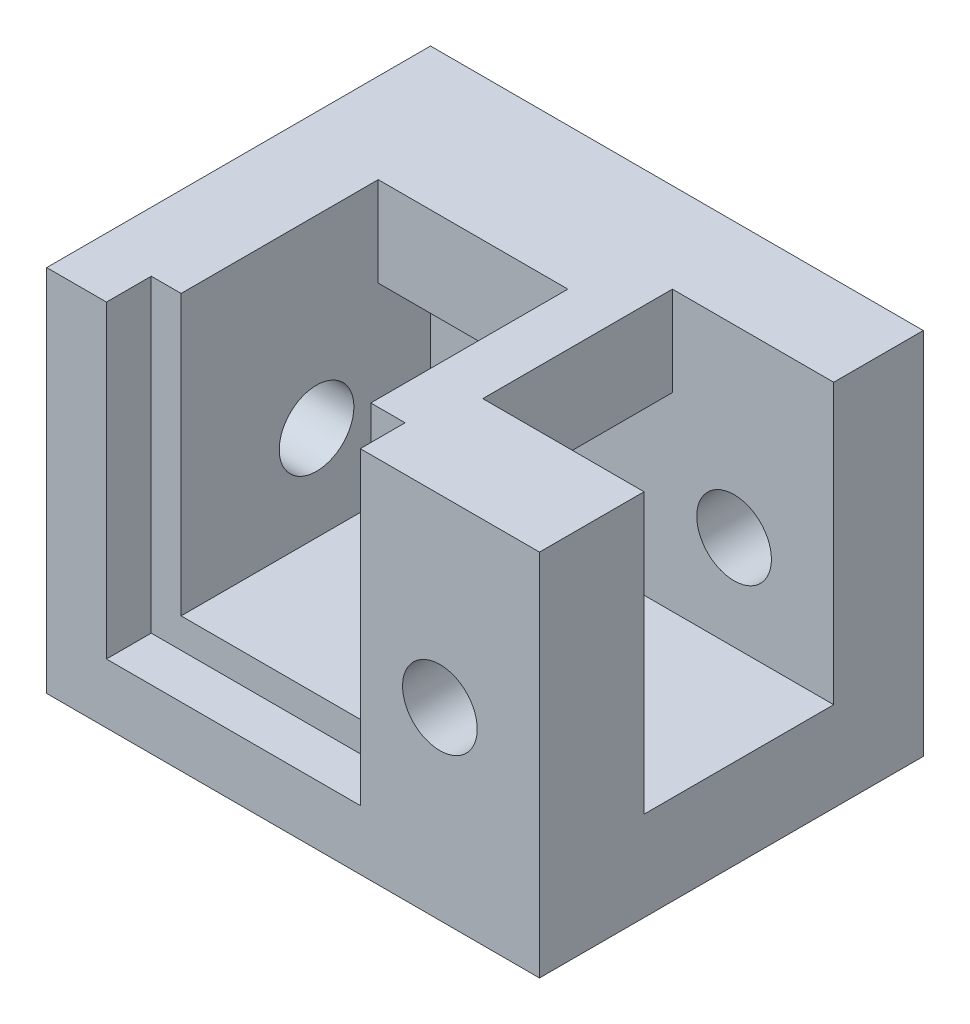
ISO-10303-21;
HEADER;
FILE_DESCRIPTION(('STEP AP214'),'2;1');
FILE_NAME('part.step','',(''),(''),'','','');
FILE_SCHEMA(('AUTOMOTIVE_DESIGN { 1 0 10303 214 1 1 1 1 }'));
ENDSEC;
DATA;
#1=APPLICATION_CONTEXT('core data for automotive mechanical design processes');
#2=APPLICATION_PROTOCOL_DEFINITION('international standard','automotive_design',2000,#1);
#3=PRODUCT_CONTEXT('',#1,'mechanical');
#4=PRODUCT('Part','Part','',(#3));
#5=PRODUCT_RELATED_PRODUCT_CATEGORY('part','',(#4));
#6=PRODUCT_DEFINITION_FORMATION('','',#4);
#7=PRODUCT_DEFINITION_CONTEXT('part definition',#1,'design');
#8=PRODUCT_DEFINITION('design','',#6,#7);
#9=PRODUCT_DEFINITION_SHAPE('','',#8);
#10=(LENGTH_UNIT() NAMED_UNIT(*) SI_UNIT(.MILLI.,.METRE.));
#11=(NAMED_UNIT(*) PLANE_ANGLE_UNIT() SI_UNIT($,.RADIAN.));
#12=(NAMED_UNIT(*) SI_UNIT($,.STERADIAN.) SOLID_ANGLE_UNIT());
#13=UNCERTAINTY_MEASURE_WITH_UNIT(LENGTH_MEASURE(1.E-05),#10,'distance_accuracy_value','');
#14=(GEOMETRIC_REPRESENTATION_CONTEXT(3) GLOBAL_UNCERTAINTY_ASSIGNED_CONTEXT((#13)) GLOBAL_UNIT_ASSIGNED_CONTEXT((#10,
#11,#12)) REPRESENTATION_CONTEXT('',''));
#15=CARTESIAN_POINT('',(0.,0.,0.));
#16=DIRECTION('',(0.,0.,1.));
#17=DIRECTION('',(1.,0.,0.));
#18=AXIS2_PLACEMENT_3D('',#15,#16,#17);
#19=CARTESIAN_POINT('',(0.,6.,0.));
#20=DIRECTION('',(0.,0.,-1.));
#21=DIRECTION('',(-1.,0.,0.));
#22=AXIS2_PLACEMENT_3D('',#19,#20,#21);
#23=PLANE('',#22);
#24=DIRECTION('',(-1.,0.,0.));
#25=VECTOR('',#24,1.);
#26=CARTESIAN_POINT('',(21.,4.,0.));
#27=LINE('',#26,#25);
#28=CARTESIAN_POINT('',(21.,4.,0.));
#29=VERTEX_POINT('',#28);
#30=CARTESIAN_POINT('',(4.,4.,0.));
#31=VERTEX_POINT('',#30);
#32=EDGE_CURVE('E201',#29,#31,#27,.T.);
#33=ORIENTED_EDGE('',*,*,#32,.F.);
#34=DIRECTION('',(0.,-1.,0.));
#35=VECTOR('',#34,1.);
#36=CARTESIAN_POINT('',(21.,24.7,0.));
#37=LINE('',#36,#35);
#38=CARTESIAN_POINT('',(21.,24.7,0.));
#39=VERTEX_POINT('',#38);
#40=EDGE_CURVE('E55',#39,#29,#37,.T.);
#41=ORIENTED_EDGE('',*,*,#40,.F.);
#42=DIRECTION('',(1.,0.,0.));
#43=VECTOR('',#42,1.);
#44=CARTESIAN_POINT('',(0.,24.7,0.));
#45=LINE('',#44,#43);
#46=CARTESIAN_POINT('',(18.7,24.7,0.));
#47=VERTEX_POINT('',#46);
#48=EDGE_CURVE('E248',#47,#39,#45,.T.);
#49=ORIENTED_EDGE('',*,*,#48,.F.);
#50=DIRECTION('',(0.,-1.,0.));
#51=VECTOR('',#50,1.);
#52=CARTESIAN_POINT('',(18.7,18.7,0.));
#53=LINE('',#52,#51);
#54=CARTESIAN_POINT('',(18.7,6.,0.));
#55=VERTEX_POINT('',#54);
#56=EDGE_CURVE('E311',#47,#55,#53,.T.);
#57=ORIENTED_EDGE('',*,*,#56,.T.);
#58=DIRECTION('',(1.,0.,0.));
#59=VECTOR('',#58,1.);
#60=CARTESIAN_POINT('',(0.,6.,0.));
#61=LINE('',#60,#59);
#62=CARTESIAN_POINT('',(6.,6.,0.));
#63=VERTEX_POINT('',#62);
#64=EDGE_CURVE('E320',#63,#55,#61,.T.);
#65=ORIENTED_EDGE('',*,*,#64,.F.);
#66=DIRECTION('',(0.,-1.,0.));
#67=VECTOR('',#66,1.);
#68=CARTESIAN_POINT('',(6.,18.7,0.));
#69=LINE('',#68,#67);
#70=CARTESIAN_POINT('',(6.,24.7,0.));
#71=VERTEX_POINT('',#70);
#72=EDGE_CURVE('E302',#71,#63,#69,.T.);
#73=ORIENTED_EDGE('',*,*,#72,.F.);
#74=DIRECTION('',(1.,0.,0.));
#75=VECTOR('',#74,1.);
#76=CARTESIAN_POINT('',(0.,24.7,0.));
#77=LINE('',#76,#75);
#78=CARTESIAN_POINT('',(4.,24.7,0.));
#79=VERTEX_POINT('',#78);
#80=EDGE_CURVE('E182',#79,#71,#77,.T.);
#81=ORIENTED_EDGE('',*,*,#80,.F.);
#82=DIRECTION('',(0.,1.,0.));
#83=VECTOR('',#82,1.);
#84=CARTESIAN_POINT('',(4.,4.,0.));
#85=LINE('',#84,#83);
#86=EDGE_CURVE('E199',#31,#79,#85,.T.);
#87=ORIENTED_EDGE('',*,*,#86,.F.);
#88=EDGE_LOOP('',(#33,#41,#49,#57,#65,#73,#81,#87));
#89=FACE_BOUND('',#88,.T.);
#90=ADVANCED_FACE('F39',(#89),#23,.F.);
#91=CARTESIAN_POINT('',(21.,24.7,3.));
#92=DIRECTION('',(1.,0.,0.));
#93=DIRECTION('',(0.,1.,0.));
#94=AXIS2_PLACEMENT_3D('',#91,#92,#93);
#95=PLANE('',#94);
#96=DIRECTION('',(0.,0.,-1.));
#97=VECTOR('',#96,1.);
#98=CARTESIAN_POINT('',(21.,4.,3.));
#99=LINE('',#98,#97);
#100=CARTESIAN_POINT('',(21.,4.,3.));
#101=VERTEX_POINT('',#100);
#102=EDGE_CURVE('E212',#101,#29,#99,.T.);
#103=ORIENTED_EDGE('',*,*,#102,.F.);
#104=DIRECTION('',(0.,-1.,0.));
#105=VECTOR('',#104,1.);
#106=CARTESIAN_POINT('',(21.,24.7,3.));
#107=LINE('',#106,#105);
#108=CARTESIAN_POINT('',(21.,24.7,3.));
#109=VERTEX_POINT('',#108);
#110=EDGE_CURVE('E221',#109,#101,#107,.T.);
#111=ORIENTED_EDGE('',*,*,#110,.F.);
#112=DIRECTION('',(0.,0.,-1.));
#113=VECTOR('',#112,1.);
#114=CARTESIAN_POINT('',(21.,24.7,3.));
#115=LINE('',#114,#113);
#116=EDGE_CURVE('E226',#109,#39,#115,.T.);
#117=ORIENTED_EDGE('',*,*,#116,.T.);
#118=ORIENTED_EDGE('',*,*,#40,.T.);
#119=EDGE_LOOP('',(#103,#111,#117,#118));
#120=FACE_BOUND('',#119,.T.);
#121=ADVANCED_FACE('F344',(#120),#95,.F.);
#122=CARTESIAN_POINT('',(0.,6.,0.));
#123=DIRECTION('',(0.,-1.,0.));
#124=DIRECTION('',(0.,0.,-1.));
#125=AXIS2_PLACEMENT_3D('',#122,#123,#124);
#126=PLANE('',#125);
#127=DIRECTION('',(0.,0.,-1.));
#128=VECTOR('',#127,1.);
#129=CARTESIAN_POINT('',(6.,6.,0.));
#130=LINE('',#129,#128);
#131=CARTESIAN_POINT('',(6.,6.,-16.7));
#132=VERTEX_POINT('',#131);
#133=EDGE_CURVE('E287',#63,#132,#130,.T.);
#134=ORIENTED_EDGE('',*,*,#133,.F.);
#135=ORIENTED_EDGE('',*,*,#64,.T.);
#136=DIRECTION('',(0.,0.,1.));
#137=VECTOR('',#136,1.);
#138=CARTESIAN_POINT('',(18.7,6.,0.));
#139=LINE('',#138,#137);
#140=CARTESIAN_POINT('',(18.7,6.,-4.));
#141=VERTEX_POINT('',#140);
#142=EDGE_CURVE('E308',#141,#55,#139,.T.);
#143=ORIENTED_EDGE('',*,*,#142,.F.);
#144=DIRECTION('',(-1.,0.,0.));
#145=VECTOR('',#144,1.);
#146=CARTESIAN_POINT('',(18.7,6.,-4.));
#147=LINE('',#146,#145);
#148=CARTESIAN_POINT('',(33.,6.,-4.));
#149=VERTEX_POINT('',#148);
#150=EDGE_CURVE('E305',#149,#141,#147,.T.);
#151=ORIENTED_EDGE('',*,*,#150,.F.);
#152=DIRECTION('',(0.,0.,-1.));
#153=VECTOR('',#152,1.);
#154=CARTESIAN_POINT('',(33.,6.,0.));
#155=LINE('',#154,#153);
#156=CARTESIAN_POINT('',(33.,6.,-16.7));
#157=VERTEX_POINT('',#156);
#158=EDGE_CURVE('E322',#149,#157,#155,.T.);
#159=ORIENTED_EDGE('',*,*,#158,.T.);
#160=DIRECTION('',(1.,0.,0.));
#161=VECTOR('',#160,1.);
#162=CARTESIAN_POINT('',(6.,6.,-16.7));
#163=LINE('',#162,#161);
#164=EDGE_CURVE('E290',#132,#157,#163,.T.);
#165=ORIENTED_EDGE('',*,*,#164,.F.);
#166=EDGE_LOOP('',(#134,#135,#143,#151,#159,#165));
#167=FACE_BOUND('',#166,.T.);
#168=ADVANCED_FACE('F366',(#167),#126,.F.);
#169=CARTESIAN_POINT('',(0.,6.,0.));
#170=DIRECTION('',(1.,0.,0.));
#171=DIRECTION('',(0.,0.,-1.));
#172=AXIS2_PLACEMENT_3D('',#169,#170,#171);
#173=PLANE('',#172);
#174=CARTESIAN_POINT('',(0.,12.35,-9.07));
#175=DIRECTION('',(1.,0.,0.));
#176=DIRECTION('',(0.,0.,-1.));
#177=AXIS2_PLACEMENT_3D('',#174,#175,#176);
#178=CIRCLE('',#177,2.5);
#179=CARTESIAN_POINT('',(0.,12.35,-11.57));
#180=VERTEX_POINT('',#179);
#181=EDGE_CURVE('E276',#180,#180,#178,.T.);
#182=ORIENTED_EDGE('',*,*,#181,.T.);
#183=EDGE_LOOP('',(#182));
#184=FACE_BOUND('',#183,.T.);
#185=DIRECTION('',(0.,0.,1.));
#186=VECTOR('',#185,1.);
#187=CARTESIAN_POINT('',(0.,0.,0.));
#188=LINE('',#187,#186);
#189=CARTESIAN_POINT('',(0.,0.,-22.7));
#190=VERTEX_POINT('',#189);
#191=CARTESIAN_POINT('',(0.,0.,3.));
#192=VERTEX_POINT('',#191);
#193=EDGE_CURVE('E187',#190,#192,#188,.T.);
#194=ORIENTED_EDGE('',*,*,#193,.T.);
#195=DIRECTION('',(0.,-1.,0.));
#196=VECTOR('',#195,1.);
#197=CARTESIAN_POINT('',(0.,24.7,3.));
#198=LINE('',#197,#196);
#199=CARTESIAN_POINT('',(0.,24.7,3.));
#200=VERTEX_POINT('',#199);
#201=EDGE_CURVE('E185',#200,#192,#198,.T.);
#202=ORIENTED_EDGE('',*,*,#201,.F.);
#203=DIRECTION('',(0.,0.,1.));
#204=VECTOR('',#203,1.);
#205=CARTESIAN_POINT('',(0.,24.7,0.));
#206=LINE('',#205,#204);
#207=CARTESIAN_POINT('',(0.,24.7,-22.7));
#208=VERTEX_POINT('',#207);
#209=EDGE_CURVE('E170',#208,#200,#206,.T.);
#210=ORIENTED_EDGE('',*,*,#209,.F.);
#211=DIRECTION('',(0.,-1.,0.));
#212=VECTOR('',#211,1.);
#213=CARTESIAN_POINT('',(0.,6.,-22.7));
#214=LINE('',#213,#212);
#215=EDGE_CURVE('E48',#208,#190,#214,.T.);
#216=ORIENTED_EDGE('',*,*,#215,.T.);
#217=EDGE_LOOP('',(#194,#202,#210,#216));
#218=FACE_BOUND('',#217,.T.);
#219=ADVANCED_FACE('F41',(#184,#218),#173,.F.);
#220=CARTESIAN_POINT('',(33.,6.,0.));
#221=DIRECTION('',(-1.,0.,0.));
#222=DIRECTION('',(0.,0.,1.));
#223=AXIS2_PLACEMENT_3D('',#220,#221,#222);
#224=PLANE('',#223);
#225=DIRECTION('',(0.,0.,-1.));
#226=VECTOR('',#225,1.);
#227=CARTESIAN_POINT('',(33.,0.,0.));
#228=LINE('',#227,#226);
#229=CARTESIAN_POINT('',(33.,0.,3.));
#230=VERTEX_POINT('',#229);
#231=CARTESIAN_POINT('',(33.,0.,-22.7));
#232=VERTEX_POINT('',#231);
#233=EDGE_CURVE('E326',#230,#232,#228,.T.);
#234=ORIENTED_EDGE('',*,*,#233,.T.);
#235=DIRECTION('',(0.,-1.,0.));
#236=VECTOR('',#235,1.);
#237=CARTESIAN_POINT('',(33.,6.,-22.7));
#238=LINE('',#237,#236);
#239=CARTESIAN_POINT('',(33.,24.7,-22.7));
#240=VERTEX_POINT('',#239);
#241=EDGE_CURVE('E11',#240,#232,#238,.T.);
#242=ORIENTED_EDGE('',*,*,#241,.F.);
#243=DIRECTION('',(0.,0.,-1.));
#244=VECTOR('',#243,1.);
#245=CARTESIAN_POINT('',(33.,24.7,0.));
#246=LINE('',#245,#244);
#247=CARTESIAN_POINT('',(33.,24.7,-16.7));
#248=VERTEX_POINT('',#247);
#249=EDGE_CURVE('E237',#248,#240,#246,.T.);
#250=ORIENTED_EDGE('',*,*,#249,.F.);
#251=DIRECTION('',(0.,-1.,0.));
#252=VECTOR('',#251,1.);
#253=CARTESIAN_POINT('',(33.,18.7,-16.7));
#254=LINE('',#253,#252);
#255=EDGE_CURVE('E292',#248,#157,#254,.T.);
#256=ORIENTED_EDGE('',*,*,#255,.T.);
#257=ORIENTED_EDGE('',*,*,#158,.F.);
#258=DIRECTION('',(0.,-1.,0.));
#259=VECTOR('',#258,1.);
#260=CARTESIAN_POINT('',(33.,18.7,-4.));
#261=LINE('',#260,#259);
#262=CARTESIAN_POINT('',(33.,24.7,-4.));
#263=VERTEX_POINT('',#262);
#264=EDGE_CURVE('E317',#263,#149,#261,.T.);
#265=ORIENTED_EDGE('',*,*,#264,.F.);
#266=DIRECTION('',(0.,0.,-1.));
#267=VECTOR('',#266,1.);
#268=CARTESIAN_POINT('',(33.,24.7,0.));
#269=LINE('',#268,#267);
#270=CARTESIAN_POINT('',(33.,24.7,3.));
#271=VERTEX_POINT('',#270);
#272=EDGE_CURVE('E250',#271,#263,#269,.T.);
#273=ORIENTED_EDGE('',*,*,#272,.F.);
#274=DIRECTION('',(0.,1.,0.));
#275=VECTOR('',#274,1.);
#276=CARTESIAN_POINT('',(33.,24.7,3.));
#277=LINE('',#276,#275);
#278=EDGE_CURVE('E217',#230,#271,#277,.T.);
#279=ORIENTED_EDGE('',*,*,#278,.F.);
#280=EDGE_LOOP('',(#234,#242,#250,#256,#257,#265,#273,#279));
#281=FACE_BOUND('',#280,.T.);
#282=ADVANCED_FACE('F335',(#281),#224,.F.);
#283=CARTESIAN_POINT('',(0.,6.,-22.7));
#284=DIRECTION('',(0.,0.,1.));
#285=DIRECTION('',(1.,0.,0.));
#286=AXIS2_PLACEMENT_3D('',#283,#284,#285);
#287=PLANE('',#286);
#288=CARTESIAN_POINT('',(26.33,12.35,-22.7));
#289=DIRECTION('',(0.,0.,1.));
#290=DIRECTION('',(1.,0.,0.));
#291=AXIS2_PLACEMENT_3D('',#288,#289,#290);
#292=CIRCLE('',#291,2.5);
#293=CARTESIAN_POINT('',(28.83,12.35,-22.7));
#294=VERTEX_POINT('',#293);
#295=EDGE_CURVE('E279',#294,#294,#292,.T.);
#296=ORIENTED_EDGE('',*,*,#295,.T.);
#297=EDGE_LOOP('',(#296));
#298=FACE_BOUND('',#297,.T.);
#299=DIRECTION('',(-1.,0.,0.));
#300=VECTOR('',#299,1.);
#301=CARTESIAN_POINT('',(0.,0.,-22.7));
#302=LINE('',#301,#300);
#303=EDGE_CURVE('E323',#232,#190,#302,.T.);
#304=ORIENTED_EDGE('',*,*,#303,.T.);
#305=ORIENTED_EDGE('',*,*,#215,.F.);
#306=DIRECTION('',(-1.,0.,0.));
#307=VECTOR('',#306,1.);
#308=CARTESIAN_POINT('',(0.,24.7,-22.7));
#309=LINE('',#308,#307);
#310=EDGE_CURVE('E179',#240,#208,#309,.T.);
#311=ORIENTED_EDGE('',*,*,#310,.F.);
#312=ORIENTED_EDGE('',*,*,#241,.T.);
#313=EDGE_LOOP('',(#304,#305,#311,#312));
#314=FACE_BOUND('',#313,.T.);
#315=ADVANCED_FACE('F377',(#298,#314),#287,.F.);
#316=CARTESIAN_POINT('',(0.,0.,0.));
#317=DIRECTION('',(0.,-1.,0.));
#318=DIRECTION('',(0.,0.,-1.));
#319=AXIS2_PLACEMENT_3D('',#316,#317,#318);
#320=PLANE('',#319);
#321=ORIENTED_EDGE('',*,*,#193,.F.);
#322=ORIENTED_EDGE('',*,*,#303,.F.);
#323=ORIENTED_EDGE('',*,*,#233,.F.);
#324=DIRECTION('',(1.,0.,0.));
#325=VECTOR('',#324,1.);
#326=CARTESIAN_POINT('',(33.,0.,3.));
#327=LINE('',#326,#325);
#328=EDGE_CURVE('E224',#192,#230,#327,.T.);
#329=ORIENTED_EDGE('',*,*,#328,.F.);
#330=EDGE_LOOP('',(#321,#322,#323,#329));
#331=FACE_BOUND('',#330,.T.);
#332=ADVANCED_FACE('F332',(#331),#320,.T.);
#333=CARTESIAN_POINT('',(18.7,18.7,-4.));
#334=DIRECTION('',(0.,0.,1.));
#335=DIRECTION('',(1.,0.,0.));
#336=AXIS2_PLACEMENT_3D('',#333,#334,#335);
#337=PLANE('',#336);
#338=CARTESIAN_POINT('',(26.33,12.35,-4.));
#339=DIRECTION('',(0.,0.,1.));
#340=DIRECTION('',(1.,0.,0.));
#341=AXIS2_PLACEMENT_3D('',#338,#339,#340);
#342=CIRCLE('',#341,2.5);
#343=CARTESIAN_POINT('',(28.83,12.35,-4.));
#344=VERTEX_POINT('',#343);
#345=EDGE_CURVE('E284',#344,#344,#342,.T.);
#346=ORIENTED_EDGE('',*,*,#345,.T.);
#347=EDGE_LOOP('',(#346));
#348=FACE_BOUND('',#347,.T.);
#349=ORIENTED_EDGE('',*,*,#150,.T.);
#350=DIRECTION('',(0.,-1.,0.));
#351=VECTOR('',#350,1.);
#352=CARTESIAN_POINT('',(18.7,18.7,-4.));
#353=LINE('',#352,#351);
#354=CARTESIAN_POINT('',(18.7,18.7,-4.));
#355=VERTEX_POINT('',#354);
#356=EDGE_CURVE('E314',#355,#141,#353,.T.);
#357=ORIENTED_EDGE('',*,*,#356,.F.);
#358=DIRECTION('',(-1.,0.,0.));
#359=VECTOR('',#358,1.);
#360=CARTESIAN_POINT('',(18.7,18.7,-4.));
#361=LINE('',#360,#359);
#362=CARTESIAN_POINT('',(22.2,18.7,-4.));
#363=VERTEX_POINT('',#362);
#364=EDGE_CURVE('E272',#363,#355,#361,.T.);
#365=ORIENTED_EDGE('',*,*,#364,.F.);
#366=DIRECTION('',(0.,-1.,0.));
#367=VECTOR('',#366,1.);
#368=CARTESIAN_POINT('',(22.2,24.7,-4.));
#369=LINE('',#368,#367);
#370=CARTESIAN_POINT('',(22.2,24.7,-4.));
#371=VERTEX_POINT('',#370);
#372=EDGE_CURVE('E255',#371,#363,#369,.T.);
#373=ORIENTED_EDGE('',*,*,#372,.F.);
#374=DIRECTION('',(-1.,0.,0.));
#375=VECTOR('',#374,1.);
#376=CARTESIAN_POINT('',(0.,24.7,-4.));
#377=LINE('',#376,#375);
#378=EDGE_CURVE('E253',#263,#371,#377,.T.);
#379=ORIENTED_EDGE('',*,*,#378,.F.);
#380=ORIENTED_EDGE('',*,*,#264,.T.);
#381=EDGE_LOOP('',(#349,#357,#365,#373,#379,#380));
#382=FACE_BOUND('',#381,.T.);
#383=ADVANCED_FACE('F368',(#348,#382),#337,.F.);
#384=CARTESIAN_POINT('',(18.7,18.7,0.));
#385=DIRECTION('',(1.,0.,0.));
#386=DIRECTION('',(0.,0.,-1.));
#387=AXIS2_PLACEMENT_3D('',#384,#385,#386);
#388=PLANE('',#387);
#389=ORIENTED_EDGE('',*,*,#142,.T.);
#390=ORIENTED_EDGE('',*,*,#56,.F.);
#391=DIRECTION('',(0.,0.,1.));
#392=VECTOR('',#391,1.);
#393=CARTESIAN_POINT('',(18.7,24.7,0.));
#394=LINE('',#393,#392);
#395=CARTESIAN_POINT('',(18.7,24.7,-13.2));
#396=VERTEX_POINT('',#395);
#397=EDGE_CURVE('E245',#396,#47,#394,.T.);
#398=ORIENTED_EDGE('',*,*,#397,.F.);
#399=DIRECTION('',(0.,-1.,0.));
#400=VECTOR('',#399,1.);
#401=CARTESIAN_POINT('',(18.7,24.7,-13.2));
#402=LINE('',#401,#400);
#403=CARTESIAN_POINT('',(18.7,18.7,-13.2));
#404=VERTEX_POINT('',#403);
#405=EDGE_CURVE('E264',#396,#404,#402,.T.);
#406=ORIENTED_EDGE('',*,*,#405,.T.);
#407=DIRECTION('',(0.,0.,1.));
#408=VECTOR('',#407,1.);
#409=CARTESIAN_POINT('',(18.7,18.7,0.));
#410=LINE('',#409,#408);
#411=EDGE_CURVE('E234',#404,#355,#410,.T.);
#412=ORIENTED_EDGE('',*,*,#411,.T.);
#413=ORIENTED_EDGE('',*,*,#356,.T.);
#414=EDGE_LOOP('',(#389,#390,#398,#406,#412,#413));
#415=FACE_BOUND('',#414,.T.);
#416=ADVANCED_FACE('F364',(#415),#388,.F.);
#417=CARTESIAN_POINT('',(6.,18.7,0.));
#418=DIRECTION('',(-1.,0.,0.));
#419=DIRECTION('',(0.,0.,1.));
#420=AXIS2_PLACEMENT_3D('',#417,#418,#419);
#421=PLANE('',#420);
#422=CARTESIAN_POINT('',(6.,12.35,-9.07));
#423=DIRECTION('',(1.,0.,0.));
#424=DIRECTION('',(0.,0.,-1.));
#425=AXIS2_PLACEMENT_3D('',#422,#423,#424);
#426=CIRCLE('',#425,2.5);
#427=CARTESIAN_POINT('',(6.,12.35,-11.57));
#428=VERTEX_POINT('',#427);
#429=EDGE_CURVE('E275',#428,#428,#426,.T.);
#430=ORIENTED_EDGE('',*,*,#429,.F.);
#431=EDGE_LOOP('',(#430));
#432=FACE_BOUND('',#431,.T.);
#433=ORIENTED_EDGE('',*,*,#133,.T.);
#434=DIRECTION('',(0.,-1.,0.));
#435=VECTOR('',#434,1.);
#436=CARTESIAN_POINT('',(6.,18.7,-16.7));
#437=LINE('',#436,#435);
#438=CARTESIAN_POINT('',(6.,18.7,-16.7));
#439=VERTEX_POINT('',#438);
#440=EDGE_CURVE('E299',#439,#132,#437,.T.);
#441=ORIENTED_EDGE('',*,*,#440,.F.);
#442=DIRECTION('',(0.,0.,-1.));
#443=VECTOR('',#442,1.);
#444=CARTESIAN_POINT('',(6.,18.7,0.));
#445=LINE('',#444,#443);
#446=CARTESIAN_POINT('',(6.,18.7,-13.2));
#447=VERTEX_POINT('',#446);
#448=EDGE_CURVE('E288',#447,#439,#445,.T.);
#449=ORIENTED_EDGE('',*,*,#448,.F.);
#450=DIRECTION('',(0.,-1.,0.));
#451=VECTOR('',#450,1.);
#452=CARTESIAN_POINT('',(6.,24.7,-13.2));
#453=LINE('',#452,#451);
#454=CARTESIAN_POINT('',(6.,24.7,-13.2));
#455=VERTEX_POINT('',#454);
#456=EDGE_CURVE('E267',#455,#447,#453,.T.);
#457=ORIENTED_EDGE('',*,*,#456,.F.);
#458=DIRECTION('',(0.,0.,-1.));
#459=VECTOR('',#458,1.);
#460=CARTESIAN_POINT('',(6.,24.7,0.));
#461=LINE('',#460,#459);
#462=EDGE_CURVE('E241',#71,#455,#461,.T.);
#463=ORIENTED_EDGE('',*,*,#462,.F.);
#464=ORIENTED_EDGE('',*,*,#72,.T.);
#465=EDGE_LOOP('',(#433,#441,#449,#457,#463,#464));
#466=FACE_BOUND('',#465,.T.);
#467=ADVANCED_FACE('F356',(#432,#466),#421,.F.);
#468=CARTESIAN_POINT('',(6.,18.7,-16.7));
#469=DIRECTION('',(0.,0.,-1.));
#470=DIRECTION('',(-1.,0.,0.));
#471=AXIS2_PLACEMENT_3D('',#468,#469,#470);
#472=PLANE('',#471);
#473=CARTESIAN_POINT('',(26.33,12.35,-16.7));
#474=DIRECTION('',(0.,0.,-1.));
#475=DIRECTION('',(-1.,0.,0.));
#476=AXIS2_PLACEMENT_3D('',#473,#474,#475);
#477=CIRCLE('',#476,2.5);
#478=CARTESIAN_POINT('',(23.83,12.35,-16.7));
#479=VERTEX_POINT('',#478);
#480=EDGE_CURVE('E43',#479,#479,#477,.T.);
#481=ORIENTED_EDGE('',*,*,#480,.T.);
#482=EDGE_LOOP('',(#481));
#483=FACE_BOUND('',#482,.T.);
#484=ORIENTED_EDGE('',*,*,#164,.T.);
#485=ORIENTED_EDGE('',*,*,#255,.F.);
#486=DIRECTION('',(1.,0.,0.));
#487=VECTOR('',#486,1.);
#488=CARTESIAN_POINT('',(0.,24.7,-16.7));
#489=LINE('',#488,#487);
#490=CARTESIAN_POINT('',(22.2,24.7,-16.7));
#491=VERTEX_POINT('',#490);
#492=EDGE_CURVE('E233',#491,#248,#489,.T.);
#493=ORIENTED_EDGE('',*,*,#492,.F.);
#494=DIRECTION('',(0.,-1.,0.));
#495=VECTOR('',#494,1.);
#496=CARTESIAN_POINT('',(22.2,24.7,-16.7));
#497=LINE('',#496,#495);
#498=CARTESIAN_POINT('',(22.2,18.7,-16.7));
#499=VERTEX_POINT('',#498);
#500=EDGE_CURVE('E270',#491,#499,#497,.T.);
#501=ORIENTED_EDGE('',*,*,#500,.T.);
#502=DIRECTION('',(1.,0.,0.));
#503=VECTOR('',#502,1.);
#504=CARTESIAN_POINT('',(6.,18.7,-16.7));
#505=LINE('',#504,#503);
#506=EDGE_CURVE('E63',#439,#499,#505,.T.);
#507=ORIENTED_EDGE('',*,*,#506,.F.);
#508=ORIENTED_EDGE('',*,*,#440,.T.);
#509=EDGE_LOOP('',(#484,#485,#493,#501,#507,#508));
#510=FACE_BOUND('',#509,.T.);
#511=ADVANCED_FACE('F376',(#483,#510),#472,.F.);
#512=CARTESIAN_POINT('',(26.33,12.35,-22.7));
#513=DIRECTION('',(0.,0.,1.));
#514=DIRECTION('',(1.,0.,0.));
#515=AXIS2_PLACEMENT_3D('',#512,#513,#514);
#516=CYLINDRICAL_SURFACE('',#515,2.5);
#517=ORIENTED_EDGE('',*,*,#295,.F.);
#518=EDGE_LOOP('',(#517));
#519=FACE_BOUND('',#518,.T.);
#520=ORIENTED_EDGE('',*,*,#480,.F.);
#521=EDGE_LOOP('',(#520));
#522=FACE_BOUND('',#521,.T.);
#523=ADVANCED_FACE('F418',(#519,#522),#516,.F.);
#524=ORIENTED_EDGE('',*,*,#345,.F.);
#525=EDGE_LOOP('',(#524));
#526=FACE_BOUND('',#525,.T.);
#527=CARTESIAN_POINT('',(26.33,12.35,3.));
#528=DIRECTION('',(0.,0.,1.));
#529=DIRECTION('',(1.,0.,0.));
#530=AXIS2_PLACEMENT_3D('',#527,#528,#529);
#531=CIRCLE('',#530,2.5);
#532=CARTESIAN_POINT('',(28.83,12.35,3.));
#533=VERTEX_POINT('',#532);
#534=EDGE_CURVE('E214',#533,#533,#531,.T.);
#535=ORIENTED_EDGE('',*,*,#534,.T.);
#536=EDGE_LOOP('',(#535));
#537=FACE_BOUND('',#536,.T.);
#538=ADVANCED_FACE('F414',(#526,#537),#516,.F.);
#539=CARTESIAN_POINT('',(0.,12.35,-9.07));
#540=DIRECTION('',(1.,0.,0.));
#541=DIRECTION('',(0.,0.,-1.));
#542=AXIS2_PLACEMENT_3D('',#539,#540,#541);
#543=CYLINDRICAL_SURFACE('',#542,2.5);
#544=ORIENTED_EDGE('',*,*,#181,.F.);
#545=EDGE_LOOP('',(#544));
#546=FACE_BOUND('',#545,.T.);
#547=ORIENTED_EDGE('',*,*,#429,.T.);
#548=EDGE_LOOP('',(#547));
#549=FACE_BOUND('',#548,.T.);
#550=ADVANCED_FACE('F407',(#546,#549),#543,.F.);
#551=CARTESIAN_POINT('',(0.,18.7,0.));
#552=DIRECTION('',(0.,1.,0.));
#553=DIRECTION('',(0.,0.,1.));
#554=AXIS2_PLACEMENT_3D('',#551,#552,#553);
#555=PLANE('',#554);
#556=DIRECTION('',(0.,0.,-1.));
#557=VECTOR('',#556,1.);
#558=CARTESIAN_POINT('',(22.2,18.7,0.));
#559=LINE('',#558,#557);
#560=EDGE_CURVE('E230',#363,#499,#559,.T.);
#561=ORIENTED_EDGE('',*,*,#560,.F.);
#562=ORIENTED_EDGE('',*,*,#364,.T.);
#563=ORIENTED_EDGE('',*,*,#411,.F.);
#564=DIRECTION('',(1.,0.,0.));
#565=VECTOR('',#564,1.);
#566=CARTESIAN_POINT('',(0.,18.7,-13.2));
#567=LINE('',#566,#565);
#568=EDGE_CURVE('E258',#447,#404,#567,.T.);
#569=ORIENTED_EDGE('',*,*,#568,.F.);
#570=ORIENTED_EDGE('',*,*,#448,.T.);
#571=ORIENTED_EDGE('',*,*,#506,.T.);
#572=EDGE_LOOP('',(#561,#562,#563,#569,#570,#571));
#573=FACE_BOUND('',#572,.T.);
#574=ADVANCED_FACE('F404',(#573),#555,.F.);
#575=CARTESIAN_POINT('',(22.2,24.7,0.));
#576=DIRECTION('',(-1.,0.,0.));
#577=DIRECTION('',(0.,0.,1.));
#578=AXIS2_PLACEMENT_3D('',#575,#576,#577);
#579=PLANE('',#578);
#580=ORIENTED_EDGE('',*,*,#560,.T.);
#581=ORIENTED_EDGE('',*,*,#500,.F.);
#582=DIRECTION('',(0.,0.,-1.));
#583=VECTOR('',#582,1.);
#584=CARTESIAN_POINT('',(22.2,24.7,0.));
#585=LINE('',#584,#583);
#586=EDGE_CURVE('E231',#371,#491,#585,.T.);
#587=ORIENTED_EDGE('',*,*,#586,.F.);
#588=ORIENTED_EDGE('',*,*,#372,.T.);
#589=EDGE_LOOP('',(#580,#581,#587,#588));
#590=FACE_BOUND('',#589,.T.);
#591=ADVANCED_FACE('F374',(#590),#579,.F.);
#592=CARTESIAN_POINT('',(0.,24.7,-13.2));
#593=DIRECTION('',(0.,0.,-1.));
#594=DIRECTION('',(-1.,0.,0.));
#595=AXIS2_PLACEMENT_3D('',#592,#593,#594);
#596=PLANE('',#595);
#597=ORIENTED_EDGE('',*,*,#568,.T.);
#598=ORIENTED_EDGE('',*,*,#405,.F.);
#599=DIRECTION('',(1.,0.,0.));
#600=VECTOR('',#599,1.);
#601=CARTESIAN_POINT('',(0.,24.7,-13.2));
#602=LINE('',#601,#600);
#603=EDGE_CURVE('E243',#455,#396,#602,.T.);
#604=ORIENTED_EDGE('',*,*,#603,.F.);
#605=ORIENTED_EDGE('',*,*,#456,.T.);
#606=EDGE_LOOP('',(#597,#598,#604,#605));
#607=FACE_BOUND('',#606,.T.);
#608=ADVANCED_FACE('F361',(#607),#596,.F.);
#609=CARTESIAN_POINT('',(0.,24.7,0.));
#610=DIRECTION('',(0.,1.,0.));
#611=DIRECTION('',(0.,0.,1.));
#612=AXIS2_PLACEMENT_3D('',#609,#610,#611);
#613=PLANE('',#612);
#614=ORIENTED_EDGE('',*,*,#586,.T.);
#615=ORIENTED_EDGE('',*,*,#492,.T.);
#616=ORIENTED_EDGE('',*,*,#249,.T.);
#617=ORIENTED_EDGE('',*,*,#310,.T.);
#618=ORIENTED_EDGE('',*,*,#209,.T.);
#619=DIRECTION('',(-1.,0.,0.));
#620=VECTOR('',#619,1.);
#621=CARTESIAN_POINT('',(4.,24.7,3.));
#622=LINE('',#621,#620);
#623=CARTESIAN_POINT('',(4.,24.7,3.));
#624=VERTEX_POINT('',#623);
#625=EDGE_CURVE('E176',#624,#200,#622,.T.);
#626=ORIENTED_EDGE('',*,*,#625,.F.);
#627=DIRECTION('',(0.,0.,-1.));
#628=VECTOR('',#627,1.);
#629=CARTESIAN_POINT('',(4.,24.7,3.));
#630=LINE('',#629,#628);
#631=EDGE_CURVE('E206',#624,#79,#630,.T.);
#632=ORIENTED_EDGE('',*,*,#631,.T.);
#633=ORIENTED_EDGE('',*,*,#80,.T.);
#634=ORIENTED_EDGE('',*,*,#462,.T.);
#635=ORIENTED_EDGE('',*,*,#603,.T.);
#636=ORIENTED_EDGE('',*,*,#397,.T.);
#637=ORIENTED_EDGE('',*,*,#48,.T.);
#638=ORIENTED_EDGE('',*,*,#116,.F.);
#639=DIRECTION('',(-1.,0.,0.));
#640=VECTOR('',#639,1.);
#641=CARTESIAN_POINT('',(33.,24.7,3.));
#642=LINE('',#641,#640);
#643=EDGE_CURVE('E219',#271,#109,#642,.T.);
#644=ORIENTED_EDGE('',*,*,#643,.F.);
#645=ORIENTED_EDGE('',*,*,#272,.T.);
#646=ORIENTED_EDGE('',*,*,#378,.T.);
#647=EDGE_LOOP('',(#614,#615,#616,#617,#618,#626,#632,#633,#634,#635,#636,#637,#638,#644,#645,#646));
#648=FACE_BOUND('',#647,.T.);
#649=ADVANCED_FACE('F173',(#648),#613,.T.);
#650=CARTESIAN_POINT('',(0.,0.,3.));
#651=DIRECTION('',(0.,0.,-1.));
#652=DIRECTION('',(-1.,0.,0.));
#653=AXIS2_PLACEMENT_3D('',#650,#651,#652);
#654=PLANE('',#653);
#655=ORIENTED_EDGE('',*,*,#278,.T.);
#656=ORIENTED_EDGE('',*,*,#643,.T.);
#657=ORIENTED_EDGE('',*,*,#110,.T.);
#658=DIRECTION('',(-1.,0.,0.));
#659=VECTOR('',#658,1.);
#660=CARTESIAN_POINT('',(21.,4.,3.));
#661=LINE('',#660,#659);
#662=CARTESIAN_POINT('',(4.,4.,3.));
#663=VERTEX_POINT('',#662);
#664=EDGE_CURVE('E191',#101,#663,#661,.T.);
#665=ORIENTED_EDGE('',*,*,#664,.T.);
#666=DIRECTION('',(0.,1.,0.));
#667=VECTOR('',#666,1.);
#668=CARTESIAN_POINT('',(4.,4.,3.));
#669=LINE('',#668,#667);
#670=EDGE_CURVE('E197',#663,#624,#669,.T.);
#671=ORIENTED_EDGE('',*,*,#670,.T.);
#672=ORIENTED_EDGE('',*,*,#625,.T.);
#673=ORIENTED_EDGE('',*,*,#201,.T.);
#674=ORIENTED_EDGE('',*,*,#328,.T.);
#675=EDGE_LOOP('',(#655,#656,#657,#665,#671,#672,#673,#674));
#676=FACE_BOUND('',#675,.T.);
#677=ORIENTED_EDGE('',*,*,#534,.F.);
#678=EDGE_LOOP('',(#677));
#679=FACE_BOUND('',#678,.T.);
#680=ADVANCED_FACE('F194',(#676,#679),#654,.F.);
#681=CARTESIAN_POINT('',(21.,4.,3.));
#682=DIRECTION('',(0.,-1.,0.));
#683=DIRECTION('',(1.,0.,0.));
#684=AXIS2_PLACEMENT_3D('',#681,#682,#683);
#685=PLANE('',#684);
#686=ORIENTED_EDGE('',*,*,#32,.T.);
#687=DIRECTION('',(0.,0.,-1.));
#688=VECTOR('',#687,1.);
#689=CARTESIAN_POINT('',(4.,4.,3.));
#690=LINE('',#689,#688);
#691=EDGE_CURVE('E209',#663,#31,#690,.T.);
#692=ORIENTED_EDGE('',*,*,#691,.F.);
#693=ORIENTED_EDGE('',*,*,#664,.F.);
#694=ORIENTED_EDGE('',*,*,#102,.T.);
#695=EDGE_LOOP('',(#686,#692,#693,#694));
#696=FACE_BOUND('',#695,.T.);
#697=ADVANCED_FACE('F346',(#696),#685,.F.);
#698=CARTESIAN_POINT('',(4.,4.,3.));
#699=DIRECTION('',(-1.,0.,0.));
#700=DIRECTION('',(0.,0.,1.));
#701=AXIS2_PLACEMENT_3D('',#698,#699,#700);
#702=PLANE('',#701);
#703=ORIENTED_EDGE('',*,*,#86,.T.);
#704=ORIENTED_EDGE('',*,*,#631,.F.);
#705=ORIENTED_EDGE('',*,*,#670,.F.);
#706=ORIENTED_EDGE('',*,*,#691,.T.);
#707=EDGE_LOOP('',(#703,#704,#705,#706));
#708=FACE_BOUND('',#707,.T.);
#709=ADVANCED_FACE('F351',(#708),#702,.F.);
#710=CLOSED_SHELL('',(#90,#121,#168,#219,#282,#315,#332,#383,#416,#467,#511,#523,#538,#550,#574,
#591,#608,#649,#680,#697,#709));
#711=MANIFOLD_SOLID_BREP('B2',#710);
#712=ADVANCED_BREP_SHAPE_REPRESENTATION('',(#18,#711),#14);
#713=SHAPE_DEFINITION_REPRESENTATION(#9,#712);
ENDSEC;
END-ISO-10303-21;
